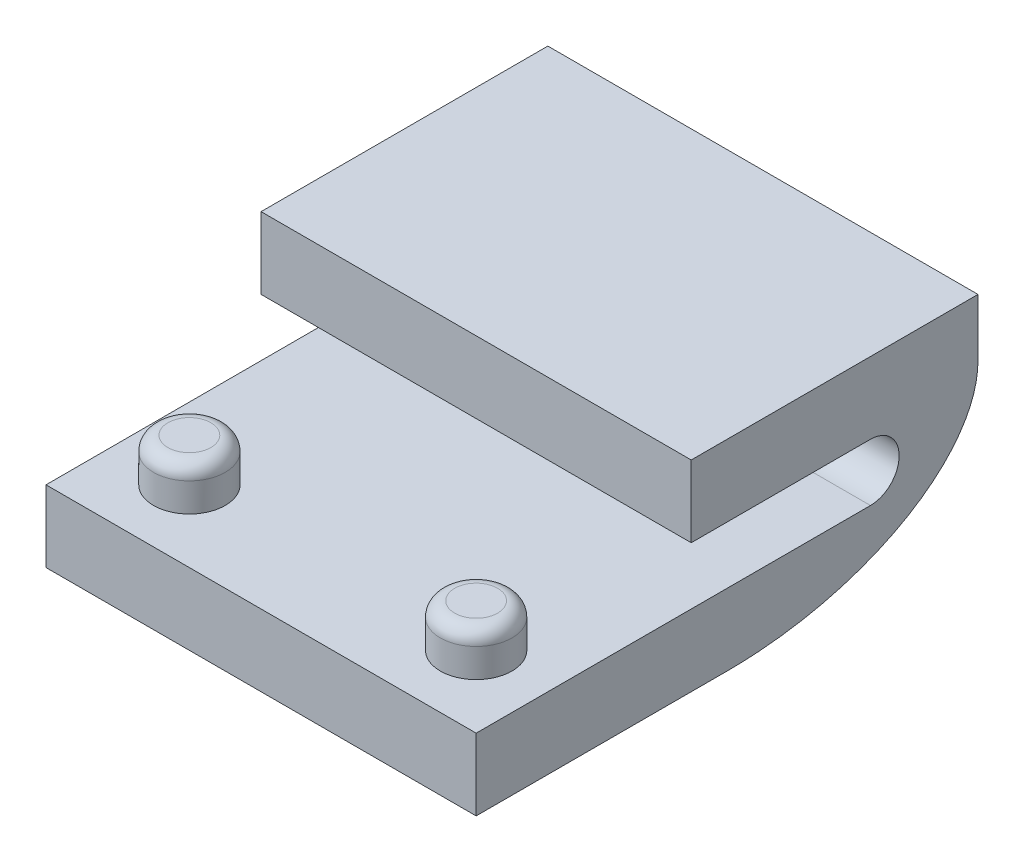
ISO-10303-21;
HEADER;
FILE_DESCRIPTION(('STEP AP214'),'2;1');
FILE_NAME('part.step','',(''),(''),'','','');
FILE_SCHEMA(('AUTOMOTIVE_DESIGN { 1 0 10303 214 1 1 1 1 }'));
ENDSEC;
DATA;
#1=APPLICATION_CONTEXT('core data for automotive mechanical design processes');
#2=APPLICATION_PROTOCOL_DEFINITION('international standard','automotive_design',2000,#1);
#3=PRODUCT_CONTEXT('',#1,'mechanical');
#4=PRODUCT('Part','Part','',(#3));
#5=PRODUCT_RELATED_PRODUCT_CATEGORY('part','',(#4));
#6=PRODUCT_DEFINITION_FORMATION('','',#4);
#7=PRODUCT_DEFINITION_CONTEXT('part definition',#1,'design');
#8=PRODUCT_DEFINITION('design','',#6,#7);
#9=PRODUCT_DEFINITION_SHAPE('','',#8);
#10=(LENGTH_UNIT() NAMED_UNIT(*) SI_UNIT(.MILLI.,.METRE.));
#11=(NAMED_UNIT(*) PLANE_ANGLE_UNIT() SI_UNIT($,.RADIAN.));
#12=(NAMED_UNIT(*) SI_UNIT($,.STERADIAN.) SOLID_ANGLE_UNIT());
#13=UNCERTAINTY_MEASURE_WITH_UNIT(LENGTH_MEASURE(1.E-05),#10,'distance_accuracy_value','');
#14=(GEOMETRIC_REPRESENTATION_CONTEXT(3) GLOBAL_UNCERTAINTY_ASSIGNED_CONTEXT((#13)) GLOBAL_UNIT_ASSIGNED_CONTEXT((#10,
#11,#12)) REPRESENTATION_CONTEXT('',''));
#15=CARTESIAN_POINT('',(0.,0.,0.));
#16=DIRECTION('',(0.,0.,1.));
#17=DIRECTION('',(1.,0.,0.));
#18=AXIS2_PLACEMENT_3D('',#15,#16,#17);
#19=CARTESIAN_POINT('',(3.,-1.,0.));
#20=DIRECTION('',(0.,0.,-1.));
#21=DIRECTION('',(-1.,0.,0.));
#22=AXIS2_PLACEMENT_3D('',#19,#20,#21);
#23=PLANE('',#22);
#24=DIRECTION('',(0.,-1.,0.));
#25=VECTOR('',#24,1.);
#26=CARTESIAN_POINT('',(-3.,-1.,0.));
#27=LINE('',#26,#25);
#28=CARTESIAN_POINT('',(-3.,0.,0.));
#29=VERTEX_POINT('',#28);
#30=CARTESIAN_POINT('',(-3.,-1.,0.));
#31=VERTEX_POINT('',#30);
#32=EDGE_CURVE('E158',#29,#31,#27,.T.);
#33=ORIENTED_EDGE('',*,*,#32,.T.);
#34=DIRECTION('',(-1.,0.,0.));
#35=VECTOR('',#34,1.);
#36=CARTESIAN_POINT('',(3.,-1.,0.));
#37=LINE('',#36,#35);
#38=CARTESIAN_POINT('',(3.,-1.,0.));
#39=VERTEX_POINT('',#38);
#40=EDGE_CURVE('E359',#39,#31,#37,.T.);
#41=ORIENTED_EDGE('',*,*,#40,.F.);
#42=DIRECTION('',(0.,-1.,0.));
#43=VECTOR('',#42,1.);
#44=CARTESIAN_POINT('',(3.,-1.,0.));
#45=LINE('',#44,#43);
#46=CARTESIAN_POINT('',(3.,0.,0.));
#47=VERTEX_POINT('',#46);
#48=EDGE_CURVE('E388',#47,#39,#45,.T.);
#49=ORIENTED_EDGE('',*,*,#48,.F.);
#50=DIRECTION('',(-1.,0.,0.));
#51=VECTOR('',#50,1.);
#52=CARTESIAN_POINT('',(3.,0.,0.));
#53=LINE('',#52,#51);
#54=EDGE_CURVE('E361',#47,#29,#53,.T.);
#55=ORIENTED_EDGE('',*,*,#54,.T.);
#56=EDGE_LOOP('',(#33,#41,#49,#55));
#57=FACE_BOUND('',#56,.T.);
#58=ADVANCED_FACE('F51',(#57),#23,.F.);
#59=CARTESIAN_POINT('',(3.,-1.,-2.5));
#60=DIRECTION('',(0.,1.,0.));
#61=DIRECTION('',(0.,0.,1.));
#62=AXIS2_PLACEMENT_3D('',#59,#60,#61);
#63=PLANE('',#62);
#64=CARTESIAN_POINT('',(2.,-1.,-1.));
#65=DIRECTION('',(0.,1.,0.));
#66=DIRECTION('',(0.,0.,-1.));
#67=AXIS2_PLACEMENT_3D('',#64,#65,#66);
#68=CIRCLE('',#67,0.5);
#69=CARTESIAN_POINT('',(2.,-1.,-1.5));
#70=VERTEX_POINT('',#69);
#71=EDGE_CURVE('E367',#70,#70,#68,.T.);
#72=ORIENTED_EDGE('',*,*,#71,.T.);
#73=EDGE_LOOP('',(#72));
#74=FACE_BOUND('',#73,.T.);
#75=CARTESIAN_POINT('',(-2.,-1.,-1.));
#76=DIRECTION('',(0.,1.,0.));
#77=DIRECTION('',(0.,0.,1.));
#78=AXIS2_PLACEMENT_3D('',#75,#76,#77);
#79=CIRCLE('',#78,0.5);
#80=CARTESIAN_POINT('',(-2.,-1.,-0.5));
#81=VERTEX_POINT('',#80);
#82=EDGE_CURVE('E300',#81,#81,#79,.F.);
#83=ORIENTED_EDGE('',*,*,#82,.F.);
#84=EDGE_LOOP('',(#83));
#85=FACE_BOUND('',#84,.T.);
#86=DIRECTION('',(0.,0.,-1.));
#87=VECTOR('',#86,1.);
#88=CARTESIAN_POINT('',(-3.,-1.,-2.5));
#89=LINE('',#88,#87);
#90=CARTESIAN_POINT('',(-3.,-1.,-2.5));
#91=VERTEX_POINT('',#90);
#92=EDGE_CURVE('E152',#31,#91,#89,.T.);
#93=ORIENTED_EDGE('',*,*,#92,.T.);
#94=DIRECTION('',(-1.,0.,0.));
#95=VECTOR('',#94,1.);
#96=CARTESIAN_POINT('',(3.,-1.,-2.5));
#97=LINE('',#96,#95);
#98=CARTESIAN_POINT('',(3.,-1.,-2.5));
#99=VERTEX_POINT('',#98);
#100=EDGE_CURVE('E132',#99,#91,#97,.T.);
#101=ORIENTED_EDGE('',*,*,#100,.F.);
#102=DIRECTION('',(0.,0.,-1.));
#103=VECTOR('',#102,1.);
#104=CARTESIAN_POINT('',(3.,-1.,-2.5));
#105=LINE('',#104,#103);
#106=EDGE_CURVE('E391',#39,#99,#105,.T.);
#107=ORIENTED_EDGE('',*,*,#106,.F.);
#108=ORIENTED_EDGE('',*,*,#40,.T.);
#109=EDGE_LOOP('',(#93,#101,#107,#108));
#110=FACE_BOUND('',#109,.T.);
#111=ADVANCED_FACE('F347',(#74,#85,#110),#63,.F.);
#112=CARTESIAN_POINT('',(3.,-1.8,3.));
#113=DIRECTION('',(0.,-1.,0.));
#114=DIRECTION('',(0.,0.,-1.));
#115=AXIS2_PLACEMENT_3D('',#112,#113,#114);
#116=PLANE('',#115);
#117=CARTESIAN_POINT('',(2.,-1.8,2.));
#118=DIRECTION('',(0.,-1.,0.));
#119=DIRECTION('',(0.,0.,1.));
#120=AXIS2_PLACEMENT_3D('',#117,#118,#119);
#121=CIRCLE('',#120,0.5);
#122=CARTESIAN_POINT('',(2.,-1.8,2.5));
#123=VERTEX_POINT('',#122);
#124=EDGE_CURVE('E364',#123,#123,#121,.T.);
#125=ORIENTED_EDGE('',*,*,#124,.T.);
#126=EDGE_LOOP('',(#125));
#127=FACE_BOUND('',#126,.T.);
#128=CARTESIAN_POINT('',(-2.,-1.8,2.));
#129=DIRECTION('',(0.,-1.,0.));
#130=DIRECTION('',(0.,0.,-1.));
#131=AXIS2_PLACEMENT_3D('',#128,#129,#130);
#132=CIRCLE('',#131,0.5);
#133=CARTESIAN_POINT('',(-2.,-1.8,1.5));
#134=VERTEX_POINT('',#133);
#135=EDGE_CURVE('E291',#134,#134,#132,.F.);
#136=ORIENTED_EDGE('',*,*,#135,.F.);
#137=EDGE_LOOP('',(#136));
#138=FACE_BOUND('',#137,.T.);
#139=DIRECTION('',(0.,0.,1.));
#140=VECTOR('',#139,1.);
#141=CARTESIAN_POINT('',(-3.,-1.8,3.));
#142=LINE('',#141,#140);
#143=CARTESIAN_POINT('',(-3.,-1.8,-2.5));
#144=VERTEX_POINT('',#143);
#145=CARTESIAN_POINT('',(-3.,-1.8,3.));
#146=VERTEX_POINT('',#145);
#147=EDGE_CURVE('E142',#144,#146,#142,.T.);
#148=ORIENTED_EDGE('',*,*,#147,.T.);
#149=DIRECTION('',(-1.,0.,0.));
#150=VECTOR('',#149,1.);
#151=CARTESIAN_POINT('',(3.,-1.8,3.));
#152=LINE('',#151,#150);
#153=CARTESIAN_POINT('',(3.,-1.8,3.));
#154=VERTEX_POINT('',#153);
#155=EDGE_CURVE('E146',#154,#146,#152,.T.);
#156=ORIENTED_EDGE('',*,*,#155,.F.);
#157=DIRECTION('',(0.,0.,1.));
#158=VECTOR('',#157,1.);
#159=CARTESIAN_POINT('',(3.,-1.8,3.));
#160=LINE('',#159,#158);
#161=CARTESIAN_POINT('',(3.,-1.8,-2.5));
#162=VERTEX_POINT('',#161);
#163=EDGE_CURVE('E144',#162,#154,#160,.T.);
#164=ORIENTED_EDGE('',*,*,#163,.F.);
#165=DIRECTION('',(-1.,0.,0.));
#166=VECTOR('',#165,1.);
#167=CARTESIAN_POINT('',(3.,-1.8,-2.5));
#168=LINE('',#167,#166);
#169=EDGE_CURVE('E129',#162,#144,#168,.T.);
#170=ORIENTED_EDGE('',*,*,#169,.T.);
#171=EDGE_LOOP('',(#148,#156,#164,#170));
#172=FACE_BOUND('',#171,.T.);
#173=ADVANCED_FACE('F140',(#127,#138,#172),#116,.F.);
#174=CARTESIAN_POINT('',(3.,-2.8,3.));
#175=DIRECTION('',(0.,0.,-1.));
#176=DIRECTION('',(-1.,0.,0.));
#177=AXIS2_PLACEMENT_3D('',#174,#175,#176);
#178=PLANE('',#177);
#179=DIRECTION('',(0.,-1.,0.));
#180=VECTOR('',#179,1.);
#181=CARTESIAN_POINT('',(-3.,-2.8,3.));
#182=LINE('',#181,#180);
#183=CARTESIAN_POINT('',(-3.,-2.8,3.));
#184=VERTEX_POINT('',#183);
#185=EDGE_CURVE('E150',#146,#184,#182,.T.);
#186=ORIENTED_EDGE('',*,*,#185,.T.);
#187=DIRECTION('',(-1.,0.,0.));
#188=VECTOR('',#187,1.);
#189=CARTESIAN_POINT('',(3.,-2.8,3.));
#190=LINE('',#189,#188);
#191=CARTESIAN_POINT('',(3.,-2.8,3.));
#192=VERTEX_POINT('',#191);
#193=EDGE_CURVE('E399',#192,#184,#190,.T.);
#194=ORIENTED_EDGE('',*,*,#193,.F.);
#195=DIRECTION('',(0.,-1.,0.));
#196=VECTOR('',#195,1.);
#197=CARTESIAN_POINT('',(3.,-2.8,3.));
#198=LINE('',#197,#196);
#199=EDGE_CURVE('E590',#154,#192,#198,.T.);
#200=ORIENTED_EDGE('',*,*,#199,.F.);
#201=ORIENTED_EDGE('',*,*,#155,.T.);
#202=EDGE_LOOP('',(#186,#194,#200,#201));
#203=FACE_BOUND('',#202,.T.);
#204=ADVANCED_FACE('F206',(#203),#178,.F.);
#205=CARTESIAN_POINT('',(3.,-2.8,-4.));
#206=DIRECTION('',(0.,1.,0.));
#207=DIRECTION('',(0.,0.,1.));
#208=AXIS2_PLACEMENT_3D('',#205,#206,#207);
#209=PLANE('',#208);
#210=DIRECTION('',(0.,0.,-1.));
#211=VECTOR('',#210,1.);
#212=CARTESIAN_POINT('',(-3.,-2.8,-4.));
#213=LINE('',#212,#211);
#214=CARTESIAN_POINT('',(-3.,-2.8,-0.5));
#215=VERTEX_POINT('',#214);
#216=EDGE_CURVE('E156',#184,#215,#213,.T.);
#217=ORIENTED_EDGE('',*,*,#216,.T.);
#218=CARTESIAN_POINT('',(3.3,-2.8,-0.5));
#219=CARTESIAN_POINT('',(1.1,-2.8,-0.5));
#220=CARTESIAN_POINT('',(-1.1,-2.8,-0.5));
#221=CARTESIAN_POINT('',(-3.3,-2.8,-0.5));
#222=(BOUNDED_CURVE() B_SPLINE_CURVE(3,(#218,#219,#220,#221),.UNSPECIFIED.,.F.,
.F.) B_SPLINE_CURVE_WITH_KNOTS((4,4),(-0.0003,0.0063),
.UNSPECIFIED.) CURVE() GEOMETRIC_REPRESENTATION_ITEM() RATIONAL_B_SPLINE_CURVE((1.,1.,1.,1.)) REPRESENTATION_ITEM(''));
#223=CARTESIAN_POINT('',(3.,-2.8,-0.5));
#224=VERTEX_POINT('',#223);
#225=EDGE_CURVE('E67',#215,#224,#222,.F.);
#226=ORIENTED_EDGE('',*,*,#225,.T.);
#227=DIRECTION('',(0.,0.,-1.));
#228=VECTOR('',#227,1.);
#229=CARTESIAN_POINT('',(3.,-2.8,-4.));
#230=LINE('',#229,#228);
#231=EDGE_CURVE('E179',#192,#224,#230,.T.);
#232=ORIENTED_EDGE('',*,*,#231,.F.);
#233=ORIENTED_EDGE('',*,*,#193,.T.);
#234=EDGE_LOOP('',(#217,#226,#232,#233));
#235=FACE_BOUND('',#234,.T.);
#236=ADVANCED_FACE('F201',(#235),#209,.F.);
#237=CARTESIAN_POINT('',(3.,0.,-4.));
#238=DIRECTION('',(0.,0.,1.));
#239=DIRECTION('',(1.,0.,0.));
#240=AXIS2_PLACEMENT_3D('',#237,#238,#239);
#241=PLANE('',#240);
#242=DIRECTION('',(0.,1.,0.));
#243=VECTOR('',#242,1.);
#244=CARTESIAN_POINT('',(3.,0.,-4.));
#245=LINE('',#244,#243);
#246=CARTESIAN_POINT('',(3.,-0.8,-4.));
#247=VERTEX_POINT('',#246);
#248=CARTESIAN_POINT('',(3.,0.,-4.));
#249=VERTEX_POINT('',#248);
#250=EDGE_CURVE('E373',#247,#249,#245,.T.);
#251=ORIENTED_EDGE('',*,*,#250,.F.);
#252=CARTESIAN_POINT('',(-3.3,-0.8,-4.));
#253=CARTESIAN_POINT('',(-1.1,-0.8,-4.));
#254=CARTESIAN_POINT('',(1.1,-0.8,-4.));
#255=CARTESIAN_POINT('',(3.3,-0.8,-4.));
#256=(BOUNDED_CURVE() B_SPLINE_CURVE(3,(#252,#253,#254,#255),.UNSPECIFIED.,.F.,
.F.) B_SPLINE_CURVE_WITH_KNOTS((4,4),(-0.0003,0.0063),
.UNSPECIFIED.) CURVE() GEOMETRIC_REPRESENTATION_ITEM() RATIONAL_B_SPLINE_CURVE((1.,1.,1.,1.)) REPRESENTATION_ITEM(''));
#257=CARTESIAN_POINT('',(-3.,-0.8,-4.));
#258=VERTEX_POINT('',#257);
#259=EDGE_CURVE('E381',#247,#258,#256,.F.);
#260=ORIENTED_EDGE('',*,*,#259,.T.);
#261=DIRECTION('',(0.,1.,0.));
#262=VECTOR('',#261,1.);
#263=CARTESIAN_POINT('',(-3.,0.,-4.));
#264=LINE('',#263,#262);
#265=CARTESIAN_POINT('',(-3.,0.,-4.));
#266=VERTEX_POINT('',#265);
#267=EDGE_CURVE('E169',#258,#266,#264,.T.);
#268=ORIENTED_EDGE('',*,*,#267,.T.);
#269=DIRECTION('',(-1.,0.,0.));
#270=VECTOR('',#269,1.);
#271=CARTESIAN_POINT('',(3.,0.,-4.));
#272=LINE('',#271,#270);
#273=EDGE_CURVE('E396',#249,#266,#272,.T.);
#274=ORIENTED_EDGE('',*,*,#273,.F.);
#275=EDGE_LOOP('',(#251,#260,#268,#274));
#276=FACE_BOUND('',#275,.T.);
#277=ADVANCED_FACE('F196',(#276),#241,.F.);
#278=CARTESIAN_POINT('',(3.,0.,0.));
#279=DIRECTION('',(0.,-1.,0.));
#280=DIRECTION('',(0.,0.,-1.));
#281=AXIS2_PLACEMENT_3D('',#278,#279,#280);
#282=PLANE('',#281);
#283=DIRECTION('',(0.,0.,1.));
#284=VECTOR('',#283,1.);
#285=CARTESIAN_POINT('',(-3.,0.,0.));
#286=LINE('',#285,#284);
#287=EDGE_CURVE('E385',#266,#29,#286,.T.);
#288=ORIENTED_EDGE('',*,*,#287,.T.);
#289=ORIENTED_EDGE('',*,*,#54,.F.);
#290=DIRECTION('',(0.,0.,1.));
#291=VECTOR('',#290,1.);
#292=CARTESIAN_POINT('',(3.,0.,0.));
#293=LINE('',#292,#291);
#294=EDGE_CURVE('E370',#249,#47,#293,.T.);
#295=ORIENTED_EDGE('',*,*,#294,.F.);
#296=ORIENTED_EDGE('',*,*,#273,.T.);
#297=EDGE_LOOP('',(#288,#289,#295,#296));
#298=FACE_BOUND('',#297,.T.);
#299=ADVANCED_FACE('F194',(#298),#282,.F.);
#300=CARTESIAN_POINT('',(3.,0.,0.));
#301=DIRECTION('',(-1.,0.,0.));
#302=DIRECTION('',(0.,0.,1.));
#303=AXIS2_PLACEMENT_3D('',#300,#301,#302);
#304=PLANE('',#303);
#305=ORIENTED_EDGE('',*,*,#106,.T.);
#306=CARTESIAN_POINT('',(3.,-1.4,-2.5));
#307=DIRECTION('',(-1.,0.,0.));
#308=DIRECTION('',(0.,0.,1.));
#309=AXIS2_PLACEMENT_3D('',#306,#307,#308);
#310=CIRCLE('',#309,0.4);
#311=EDGE_CURVE('E136',#99,#162,#310,.T.);
#312=ORIENTED_EDGE('',*,*,#311,.T.);
#313=ORIENTED_EDGE('',*,*,#163,.T.);
#314=ORIENTED_EDGE('',*,*,#199,.T.);
#315=ORIENTED_EDGE('',*,*,#231,.T.);
#316=CARTESIAN_POINT('',(3.,-0.8,-4.));
#317=CARTESIAN_POINT('',(3.,-2.8,-4.));
#318=CARTESIAN_POINT('',(3.,-2.8,-0.5));
#319=(BOUNDED_CURVE() B_SPLINE_CURVE(2,(#316,#317,#318),.UNSPECIFIED.,.F.,
.F.) B_SPLINE_CURVE_WITH_KNOTS((3,3),(0.,1.),
.UNSPECIFIED.) CURVE() GEOMETRIC_REPRESENTATION_ITEM() RATIONAL_B_SPLINE_CURVE((1.,
0.707106781186548,1.)) REPRESENTATION_ITEM(''));
#320=EDGE_CURVE('E220',#224,#247,#319,.F.);
#321=ORIENTED_EDGE('',*,*,#320,.T.);
#322=ORIENTED_EDGE('',*,*,#250,.T.);
#323=ORIENTED_EDGE('',*,*,#294,.T.);
#324=ORIENTED_EDGE('',*,*,#48,.T.);
#325=EDGE_LOOP('',(#305,#312,#313,#314,#315,#321,#322,#323,#324));
#326=FACE_BOUND('',#325,.T.);
#327=ADVANCED_FACE('F191',(#326),#304,.F.);
#328=CARTESIAN_POINT('',(-3.,0.,0.));
#329=DIRECTION('',(-1.,0.,0.));
#330=DIRECTION('',(0.,0.,1.));
#331=AXIS2_PLACEMENT_3D('',#328,#329,#330);
#332=PLANE('',#331);
#333=CARTESIAN_POINT('',(-3.,-1.4,-2.5));
#334=DIRECTION('',(-1.,0.,0.));
#335=DIRECTION('',(0.,0.,1.));
#336=AXIS2_PLACEMENT_3D('',#333,#334,#335);
#337=CIRCLE('',#336,0.4);
#338=EDGE_CURVE('E126',#91,#144,#337,.T.);
#339=ORIENTED_EDGE('',*,*,#338,.F.);
#340=ORIENTED_EDGE('',*,*,#92,.F.);
#341=ORIENTED_EDGE('',*,*,#32,.F.);
#342=ORIENTED_EDGE('',*,*,#287,.F.);
#343=ORIENTED_EDGE('',*,*,#267,.F.);
#344=CARTESIAN_POINT('',(-3.,-2.8,-0.5));
#345=CARTESIAN_POINT('',(-3.,-2.8,-4.));
#346=CARTESIAN_POINT('',(-3.,-0.8,-4.));
#347=(BOUNDED_CURVE() B_SPLINE_CURVE(2,(#344,#345,#346),.UNSPECIFIED.,.F.,
.F.) B_SPLINE_CURVE_WITH_KNOTS((3,3),(0.,1.),
.UNSPECIFIED.) CURVE() GEOMETRIC_REPRESENTATION_ITEM() RATIONAL_B_SPLINE_CURVE((1.,
0.707106781186548,1.)) REPRESENTATION_ITEM(''));
#348=EDGE_CURVE('E76',#258,#215,#347,.F.);
#349=ORIENTED_EDGE('',*,*,#348,.T.);
#350=ORIENTED_EDGE('',*,*,#216,.F.);
#351=ORIENTED_EDGE('',*,*,#185,.F.);
#352=ORIENTED_EDGE('',*,*,#147,.F.);
#353=EDGE_LOOP('',(#339,#340,#341,#342,#343,#349,#350,#351,#352));
#354=FACE_BOUND('',#353,.T.);
#355=ADVANCED_FACE('F149',(#354),#332,.T.);
#356=CARTESIAN_POINT('',(3.3,-0.8,-4.));
#357=CARTESIAN_POINT('',(1.1,-0.8,-4.));
#358=CARTESIAN_POINT('',(-1.1,-0.8,-4.));
#359=CARTESIAN_POINT('',(-3.3,-0.8,-4.));
#360=CARTESIAN_POINT('',(3.3,-2.8,-4.));
#361=CARTESIAN_POINT('',(1.1,-2.8,-4.));
#362=CARTESIAN_POINT('',(-1.1,-2.8,-4.));
#363=CARTESIAN_POINT('',(-3.3,-2.8,-4.));
#364=CARTESIAN_POINT('',(3.3,-2.8,-0.5));
#365=CARTESIAN_POINT('',(1.1,-2.8,-0.5));
#366=CARTESIAN_POINT('',(-1.1,-2.8,-0.5));
#367=CARTESIAN_POINT('',(-3.3,-2.8,-0.5));
#368=(BOUNDED_SURFACE() B_SPLINE_SURFACE(2,3,((#356,#357,#358,#359),(#360,#361,#362,#363),(#364,
#365,#366,#367)),.UNSPECIFIED.,.F.,.F.,.F.) B_SPLINE_SURFACE_WITH_KNOTS((3,3),(4,4),(0.,1.),
(-0.0003,0.0063),.UNSPECIFIED.) GEOMETRIC_REPRESENTATION_ITEM() RATIONAL_B_SPLINE_SURFACE(((1.,
1.,1.,1.),(0.707106781186548,0.707106781186548,0.707106781186548,0.707106781186548),(1.,1.,1.,1.))) REPRESENTATION_ITEM('') SURFACE());
#369=ORIENTED_EDGE('',*,*,#320,.F.);
#370=ORIENTED_EDGE('',*,*,#225,.F.);
#371=ORIENTED_EDGE('',*,*,#348,.F.);
#372=ORIENTED_EDGE('',*,*,#259,.F.);
#373=EDGE_LOOP('',(#369,#370,#371,#372));
#374=FACE_BOUND('',#373,.T.);
#375=ADVANCED_FACE('F190',(#374),#368,.T.);
#376=CARTESIAN_POINT('',(-2.,-1.2,2.));
#377=DIRECTION('',(0.,-1.,0.));
#378=DIRECTION('',(0.,0.,-1.));
#379=AXIS2_PLACEMENT_3D('',#376,#377,#378);
#380=CYLINDRICAL_SURFACE('',#379,0.5);
#381=CARTESIAN_POINT('',(-2.,-1.4,2.));
#382=DIRECTION('',(0.,1.,0.));
#383=DIRECTION('',(0.,0.,1.));
#384=AXIS2_PLACEMENT_3D('',#381,#382,#383);
#385=CIRCLE('',#384,0.5);
#386=CARTESIAN_POINT('',(-2.,-1.4,2.5));
#387=VERTEX_POINT('',#386);
#388=EDGE_CURVE('E308',#387,#387,#385,.F.);
#389=ORIENTED_EDGE('',*,*,#388,.T.);
#390=EDGE_LOOP('',(#389));
#391=FACE_BOUND('',#390,.T.);
#392=ORIENTED_EDGE('',*,*,#135,.T.);
#393=EDGE_LOOP('',(#392));
#394=FACE_BOUND('',#393,.T.);
#395=ADVANCED_FACE('F252',(#391,#394),#380,.T.);
#396=CARTESIAN_POINT('',(-2.,-1.2,2.));
#397=DIRECTION('',(0.,1.,0.));
#398=DIRECTION('',(0.,0.,1.));
#399=AXIS2_PLACEMENT_3D('',#396,#397,#398);
#400=PLANE('',#399);
#401=CARTESIAN_POINT('',(-2.,-1.2,2.));
#402=DIRECTION('',(0.,1.,0.));
#403=DIRECTION('',(0.,0.,1.));
#404=AXIS2_PLACEMENT_3D('',#401,#402,#403);
#405=CIRCLE('',#404,0.3);
#406=CARTESIAN_POINT('',(-2.,-1.2,2.3));
#407=VERTEX_POINT('',#406);
#408=EDGE_CURVE('E304',#407,#407,#405,.T.);
#409=ORIENTED_EDGE('',*,*,#408,.T.);
#410=EDGE_LOOP('',(#409));
#411=FACE_BOUND('',#410,.T.);
#412=ADVANCED_FACE('F515',(#411),#400,.T.);
#413=CARTESIAN_POINT('',(-2.,-1.4,-1.));
#414=DIRECTION('',(0.,1.,0.));
#415=DIRECTION('',(0.,0.,1.));
#416=AXIS2_PLACEMENT_3D('',#413,#414,#415);
#417=CYLINDRICAL_SURFACE('',#416,0.5);
#418=CARTESIAN_POINT('',(-2.,-1.2,-1.));
#419=DIRECTION('',(0.,-1.,0.));
#420=DIRECTION('',(0.,0.,-1.));
#421=AXIS2_PLACEMENT_3D('',#418,#419,#420);
#422=CIRCLE('',#421,0.5);
#423=CARTESIAN_POINT('',(-2.,-1.2,-1.5));
#424=VERTEX_POINT('',#423);
#425=EDGE_CURVE('E316',#424,#424,#422,.F.);
#426=ORIENTED_EDGE('',*,*,#425,.T.);
#427=EDGE_LOOP('',(#426));
#428=FACE_BOUND('',#427,.T.);
#429=ORIENTED_EDGE('',*,*,#82,.T.);
#430=EDGE_LOOP('',(#429));
#431=FACE_BOUND('',#430,.T.);
#432=ADVANCED_FACE('F505',(#428,#431),#417,.T.);
#433=CARTESIAN_POINT('',(-2.,-1.4,-1.));
#434=DIRECTION('',(0.,-1.,0.));
#435=DIRECTION('',(0.,0.,-1.));
#436=AXIS2_PLACEMENT_3D('',#433,#434,#435);
#437=PLANE('',#436);
#438=CARTESIAN_POINT('',(-2.,-1.4,-1.));
#439=DIRECTION('',(0.,-1.,0.));
#440=DIRECTION('',(0.,0.,-1.));
#441=AXIS2_PLACEMENT_3D('',#438,#439,#440);
#442=CIRCLE('',#441,0.3);
#443=CARTESIAN_POINT('',(-2.,-1.4,-1.3));
#444=VERTEX_POINT('',#443);
#445=EDGE_CURVE('E312',#444,#444,#442,.T.);
#446=ORIENTED_EDGE('',*,*,#445,.T.);
#447=EDGE_LOOP('',(#446));
#448=FACE_BOUND('',#447,.T.);
#449=ADVANCED_FACE('F496',(#448),#437,.T.);
#450=CARTESIAN_POINT('',(-2.,-1.4,2.));
#451=DIRECTION('',(0.,1.,0.));
#452=DIRECTION('',(0.,0.,1.));
#453=AXIS2_PLACEMENT_3D('',#450,#451,#452);
#454=TOROIDAL_SURFACE('',#453,0.3,0.2);
#455=ORIENTED_EDGE('',*,*,#388,.F.);
#456=EDGE_LOOP('',(#455));
#457=FACE_BOUND('',#456,.T.);
#458=ORIENTED_EDGE('',*,*,#408,.F.);
#459=EDGE_LOOP('',(#458));
#460=FACE_BOUND('',#459,.T.);
#461=ADVANCED_FACE('F254',(#457,#460),#454,.T.);
#462=CARTESIAN_POINT('',(-2.,-1.2,-1.));
#463=DIRECTION('',(0.,-1.,0.));
#464=DIRECTION('',(0.,0.,-1.));
#465=AXIS2_PLACEMENT_3D('',#462,#463,#464);
#466=TOROIDAL_SURFACE('',#465,0.3,0.2);
#467=ORIENTED_EDGE('',*,*,#425,.F.);
#468=EDGE_LOOP('',(#467));
#469=FACE_BOUND('',#468,.T.);
#470=ORIENTED_EDGE('',*,*,#445,.F.);
#471=EDGE_LOOP('',(#470));
#472=FACE_BOUND('',#471,.T.);
#473=ADVANCED_FACE('F478',(#469,#472),#466,.T.);
#474=CARTESIAN_POINT('',(2.,-1.2,2.));
#475=DIRECTION('',(0.,-1.,0.));
#476=DIRECTION('',(0.,0.,-1.));
#477=AXIS2_PLACEMENT_3D('',#474,#475,#476);
#478=CYLINDRICAL_SURFACE('',#477,0.5);
#479=CARTESIAN_POINT('',(2.,-1.4,2.));
#480=DIRECTION('',(0.,1.,0.));
#481=DIRECTION('',(0.,0.,1.));
#482=AXIS2_PLACEMENT_3D('',#479,#480,#481);
#483=CIRCLE('',#482,0.5);
#484=CARTESIAN_POINT('',(2.,-1.4,2.5));
#485=VERTEX_POINT('',#484);
#486=EDGE_CURVE('E320',#485,#485,#483,.F.);
#487=ORIENTED_EDGE('',*,*,#486,.T.);
#488=EDGE_LOOP('',(#487));
#489=FACE_BOUND('',#488,.T.);
#490=ORIENTED_EDGE('',*,*,#124,.F.);
#491=EDGE_LOOP('',(#490));
#492=FACE_BOUND('',#491,.T.);
#493=ADVANCED_FACE('F468',(#489,#492),#478,.T.);
#494=CARTESIAN_POINT('',(2.,-1.2,2.));
#495=DIRECTION('',(0.,1.,0.));
#496=DIRECTION('',(0.,0.,1.));
#497=AXIS2_PLACEMENT_3D('',#494,#495,#496);
#498=PLANE('',#497);
#499=CARTESIAN_POINT('',(2.,-1.2,2.));
#500=DIRECTION('',(0.,1.,0.));
#501=DIRECTION('',(0.,0.,1.));
#502=AXIS2_PLACEMENT_3D('',#499,#500,#501);
#503=CIRCLE('',#502,0.3);
#504=CARTESIAN_POINT('',(2.,-1.2,2.3));
#505=VERTEX_POINT('',#504);
#506=EDGE_CURVE('E324',#505,#505,#503,.T.);
#507=ORIENTED_EDGE('',*,*,#506,.T.);
#508=EDGE_LOOP('',(#507));
#509=FACE_BOUND('',#508,.T.);
#510=ADVANCED_FACE('F459',(#509),#498,.T.);
#511=CARTESIAN_POINT('',(2.,-1.4,-1.));
#512=DIRECTION('',(0.,1.,0.));
#513=DIRECTION('',(0.,0.,1.));
#514=AXIS2_PLACEMENT_3D('',#511,#512,#513);
#515=CYLINDRICAL_SURFACE('',#514,0.5);
#516=CARTESIAN_POINT('',(2.,-1.2,-1.));
#517=DIRECTION('',(0.,-1.,0.));
#518=DIRECTION('',(0.,0.,-1.));
#519=AXIS2_PLACEMENT_3D('',#516,#517,#518);
#520=CIRCLE('',#519,0.5);
#521=CARTESIAN_POINT('',(2.,-1.2,-1.5));
#522=VERTEX_POINT('',#521);
#523=EDGE_CURVE('E60',#522,#522,#520,.F.);
#524=ORIENTED_EDGE('',*,*,#523,.T.);
#525=EDGE_LOOP('',(#524));
#526=FACE_BOUND('',#525,.T.);
#527=ORIENTED_EDGE('',*,*,#71,.F.);
#528=EDGE_LOOP('',(#527));
#529=FACE_BOUND('',#528,.T.);
#530=ADVANCED_FACE('F331',(#526,#529),#515,.T.);
#531=CARTESIAN_POINT('',(2.,-1.4,-1.));
#532=DIRECTION('',(0.,-1.,0.));
#533=DIRECTION('',(0.,0.,-1.));
#534=AXIS2_PLACEMENT_3D('',#531,#532,#533);
#535=PLANE('',#534);
#536=CARTESIAN_POINT('',(2.,-1.4,-1.));
#537=DIRECTION('',(0.,-1.,0.));
#538=DIRECTION('',(0.,0.,-1.));
#539=AXIS2_PLACEMENT_3D('',#536,#537,#538);
#540=CIRCLE('',#539,0.3);
#541=CARTESIAN_POINT('',(2.,-1.4,-1.3));
#542=VERTEX_POINT('',#541);
#543=EDGE_CURVE('E12',#542,#542,#540,.T.);
#544=ORIENTED_EDGE('',*,*,#543,.T.);
#545=EDGE_LOOP('',(#544));
#546=FACE_BOUND('',#545,.T.);
#547=ADVANCED_FACE('F343',(#546),#535,.T.);
#548=CARTESIAN_POINT('',(2.,-1.4,2.));
#549=DIRECTION('',(0.,1.,0.));
#550=DIRECTION('',(0.,0.,1.));
#551=AXIS2_PLACEMENT_3D('',#548,#549,#550);
#552=TOROIDAL_SURFACE('',#551,0.3,0.2);
#553=ORIENTED_EDGE('',*,*,#506,.F.);
#554=EDGE_LOOP('',(#553));
#555=FACE_BOUND('',#554,.T.);
#556=ORIENTED_EDGE('',*,*,#486,.F.);
#557=EDGE_LOOP('',(#556));
#558=FACE_BOUND('',#557,.T.);
#559=ADVANCED_FACE('F335',(#555,#558),#552,.T.);
#560=CARTESIAN_POINT('',(2.,-1.2,-1.));
#561=DIRECTION('',(0.,-1.,0.));
#562=DIRECTION('',(0.,0.,-1.));
#563=AXIS2_PLACEMENT_3D('',#560,#561,#562);
#564=TOROIDAL_SURFACE('',#563,0.3,0.2);
#565=ORIENTED_EDGE('',*,*,#543,.F.);
#566=EDGE_LOOP('',(#565));
#567=FACE_BOUND('',#566,.T.);
#568=ORIENTED_EDGE('',*,*,#523,.F.);
#569=EDGE_LOOP('',(#568));
#570=FACE_BOUND('',#569,.T.);
#571=ADVANCED_FACE('F53',(#567,#570),#564,.T.);
#572=CARTESIAN_POINT('',(3.0175,-1.4,-2.5));
#573=DIRECTION('',(-1.,0.,0.));
#574=DIRECTION('',(0.,0.,1.));
#575=AXIS2_PLACEMENT_3D('',#572,#573,#574);
#576=CYLINDRICAL_SURFACE('',#575,0.4);
#577=ORIENTED_EDGE('',*,*,#338,.T.);
#578=ORIENTED_EDGE('',*,*,#169,.F.);
#579=ORIENTED_EDGE('',*,*,#311,.F.);
#580=ORIENTED_EDGE('',*,*,#100,.T.);
#581=EDGE_LOOP('',(#577,#578,#579,#580));
#582=FACE_BOUND('',#581,.T.);
#583=ADVANCED_FACE('F128',(#582),#576,.F.);
#584=CLOSED_SHELL('',(#58,#111,#173,#204,#236,#277,#299,#327,#355,#375,#395,#412,#432,#449,#461,
#473,#493,#510,#530,#547,#559,#571,#583));
#585=MANIFOLD_SOLID_BREP('B2',#584);
#586=ADVANCED_BREP_SHAPE_REPRESENTATION('',(#18,#585),#14);
#587=SHAPE_DEFINITION_REPRESENTATION(#9,#586);
ENDSEC;
END-ISO-10303-21;
